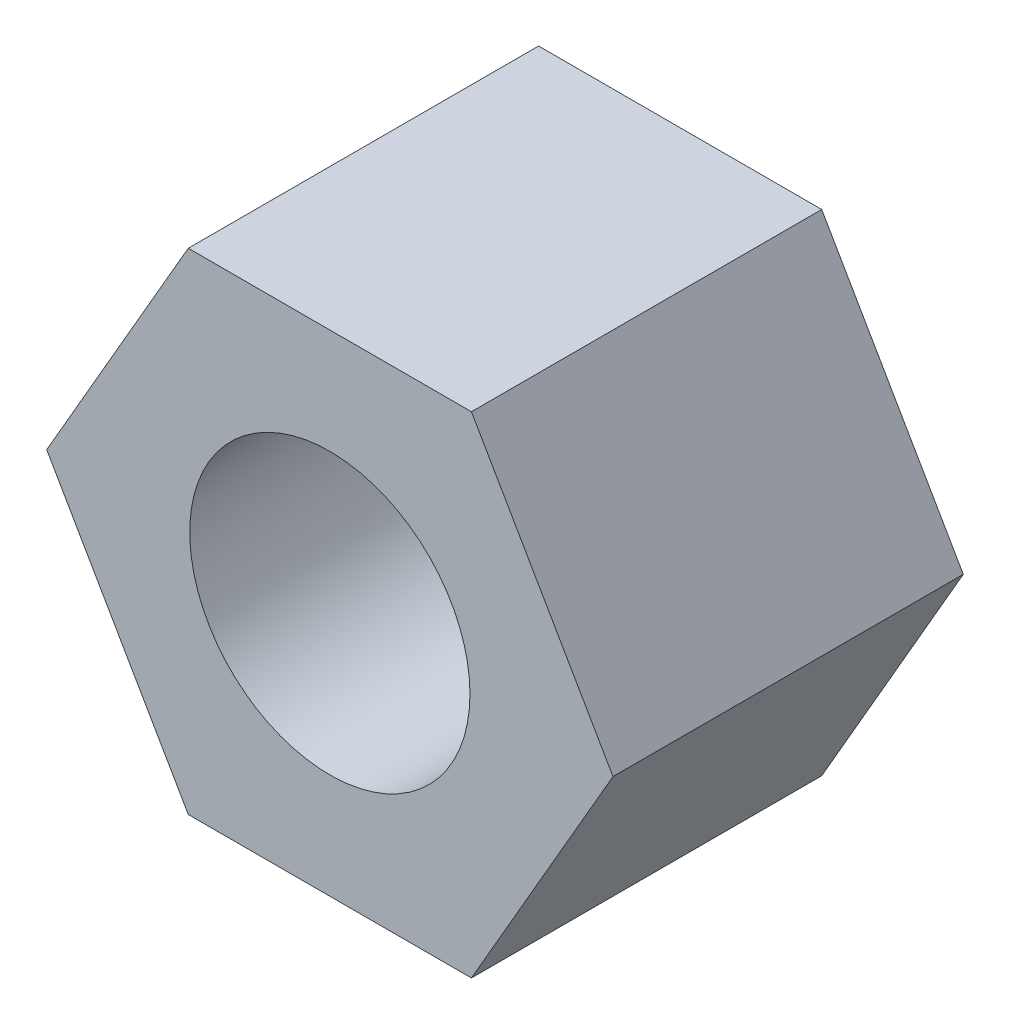
ISO-10303-21;
HEADER;
FILE_DESCRIPTION(('STEP AP214'),'2;1');
FILE_NAME('part.step','',(''),(''),'','','');
FILE_SCHEMA(('AUTOMOTIVE_DESIGN { 1 0 10303 214 1 1 1 1 }'));
ENDSEC;
DATA;
#1=APPLICATION_CONTEXT('core data for automotive mechanical design processes');
#2=APPLICATION_PROTOCOL_DEFINITION('international standard','automotive_design',2000,#1);
#3=PRODUCT_CONTEXT('',#1,'mechanical');
#4=PRODUCT('Part','Part','',(#3));
#5=PRODUCT_RELATED_PRODUCT_CATEGORY('part','',(#4));
#6=PRODUCT_DEFINITION_FORMATION('','',#4);
#7=PRODUCT_DEFINITION_CONTEXT('part definition',#1,'design');
#8=PRODUCT_DEFINITION('design','',#6,#7);
#9=PRODUCT_DEFINITION_SHAPE('','',#8);
#10=(LENGTH_UNIT() NAMED_UNIT(*) SI_UNIT(.MILLI.,.METRE.));
#11=(NAMED_UNIT(*) PLANE_ANGLE_UNIT() SI_UNIT($,.RADIAN.));
#12=(NAMED_UNIT(*) SI_UNIT($,.STERADIAN.) SOLID_ANGLE_UNIT());
#13=UNCERTAINTY_MEASURE_WITH_UNIT(LENGTH_MEASURE(1.E-05),#10,'distance_accuracy_value','');
#14=(GEOMETRIC_REPRESENTATION_CONTEXT(3) GLOBAL_UNCERTAINTY_ASSIGNED_CONTEXT((#13)) GLOBAL_UNIT_ASSIGNED_CONTEXT((#10,
#11,#12)) REPRESENTATION_CONTEXT('',''));
#15=CARTESIAN_POINT('',(0.,0.,0.));
#16=DIRECTION('',(0.,0.,1.));
#17=DIRECTION('',(1.,0.,0.));
#18=AXIS2_PLACEMENT_3D('',#15,#16,#17);
#19=CARTESIAN_POINT('',(0.,0.,5.));
#20=DIRECTION('',(0.,0.,1.));
#21=DIRECTION('',(1.,0.,0.));
#22=AXIS2_PLACEMENT_3D('',#19,#20,#21);
#23=PLANE('',#22);
#24=DIRECTION('',(0.5,0.866025403784439,0.));
#25=VECTOR('',#24,1.);
#26=CARTESIAN_POINT('',(2.02072594216369,-3.5,5.));
#27=LINE('',#26,#25);
#28=CARTESIAN_POINT('',(2.02072594216369,-3.5,5.));
#29=VERTEX_POINT('',#28);
#30=CARTESIAN_POINT('',(4.04145188432738,0.,5.));
#31=VERTEX_POINT('',#30);
#32=EDGE_CURVE('E133',#29,#31,#27,.T.);
#33=ORIENTED_EDGE('',*,*,#32,.T.);
#34=DIRECTION('',(-0.5,0.866025403784439,0.));
#35=VECTOR('',#34,1.);
#36=CARTESIAN_POINT('',(4.04145188432738,0.,5.));
#37=LINE('',#36,#35);
#38=CARTESIAN_POINT('',(2.02072594216369,3.5,5.));
#39=VERTEX_POINT('',#38);
#40=EDGE_CURVE('E94',#31,#39,#37,.T.);
#41=ORIENTED_EDGE('',*,*,#40,.T.);
#42=DIRECTION('',(-1.,0.,0.));
#43=VECTOR('',#42,1.);
#44=CARTESIAN_POINT('',(2.02072594216369,3.5,5.));
#45=LINE('',#44,#43);
#46=CARTESIAN_POINT('',(-2.02072594216369,3.5,5.));
#47=VERTEX_POINT('',#46);
#48=EDGE_CURVE('E106',#39,#47,#45,.T.);
#49=ORIENTED_EDGE('',*,*,#48,.T.);
#50=DIRECTION('',(-0.5,-0.866025403784439,0.));
#51=VECTOR('',#50,1.);
#52=CARTESIAN_POINT('',(-2.02072594216369,3.5,5.));
#53=LINE('',#52,#51);
#54=CARTESIAN_POINT('',(-4.04145188432738,0.,5.));
#55=VERTEX_POINT('',#54);
#56=EDGE_CURVE('E99',#47,#55,#53,.T.);
#57=ORIENTED_EDGE('',*,*,#56,.T.);
#58=DIRECTION('',(0.5,-0.866025403784439,0.));
#59=VECTOR('',#58,1.);
#60=CARTESIAN_POINT('',(-4.04145188432738,0.,5.));
#61=LINE('',#60,#59);
#62=CARTESIAN_POINT('',(-2.02072594216369,-3.5,5.));
#63=VERTEX_POINT('',#62);
#64=EDGE_CURVE('E104',#55,#63,#61,.T.);
#65=ORIENTED_EDGE('',*,*,#64,.T.);
#66=DIRECTION('',(1.,0.,0.));
#67=VECTOR('',#66,1.);
#68=CARTESIAN_POINT('',(-2.02072594216369,-3.5,5.));
#69=LINE('',#68,#67);
#70=EDGE_CURVE('E57',#63,#29,#69,.T.);
#71=ORIENTED_EDGE('',*,*,#70,.T.);
#72=EDGE_LOOP('',(#33,#41,#49,#57,#65,#71));
#73=FACE_BOUND('',#72,.T.);
#74=CARTESIAN_POINT('',(0.,0.,5.));
#75=DIRECTION('',(0.,0.,1.));
#76=DIRECTION('',(1.,0.,0.));
#77=AXIS2_PLACEMENT_3D('',#74,#75,#76);
#78=CIRCLE('',#77,2.);
#79=CARTESIAN_POINT('',(2.,0.,5.));
#80=VERTEX_POINT('',#79);
#81=EDGE_CURVE('E129',#80,#80,#78,.T.);
#82=ORIENTED_EDGE('',*,*,#81,.F.);
#83=EDGE_LOOP('',(#82));
#84=FACE_BOUND('',#83,.T.);
#85=ADVANCED_FACE('F39',(#73,#84),#23,.T.);
#86=CARTESIAN_POINT('',(0.,0.,0.));
#87=DIRECTION('',(0.,0.,1.));
#88=DIRECTION('',(1.,0.,0.));
#89=AXIS2_PLACEMENT_3D('',#86,#87,#88);
#90=PLANE('',#89);
#91=DIRECTION('',(0.5,0.866025403784439,0.));
#92=VECTOR('',#91,1.);
#93=CARTESIAN_POINT('',(2.02072594216369,-3.5,0.));
#94=LINE('',#93,#92);
#95=CARTESIAN_POINT('',(2.02072594216369,-3.5,0.));
#96=VERTEX_POINT('',#95);
#97=CARTESIAN_POINT('',(4.04145188432738,0.,0.));
#98=VERTEX_POINT('',#97);
#99=EDGE_CURVE('E121',#96,#98,#94,.T.);
#100=ORIENTED_EDGE('',*,*,#99,.F.);
#101=DIRECTION('',(1.,0.,0.));
#102=VECTOR('',#101,1.);
#103=CARTESIAN_POINT('',(-2.02072594216369,-3.5,0.));
#104=LINE('',#103,#102);
#105=CARTESIAN_POINT('',(-2.02072594216369,-3.5,0.));
#106=VERTEX_POINT('',#105);
#107=EDGE_CURVE('E85',#106,#96,#104,.T.);
#108=ORIENTED_EDGE('',*,*,#107,.F.);
#109=DIRECTION('',(0.5,-0.866025403784439,0.));
#110=VECTOR('',#109,1.);
#111=CARTESIAN_POINT('',(-4.04145188432738,0.,0.));
#112=LINE('',#111,#110);
#113=CARTESIAN_POINT('',(-4.04145188432738,0.,0.));
#114=VERTEX_POINT('',#113);
#115=EDGE_CURVE('E79',#114,#106,#112,.T.);
#116=ORIENTED_EDGE('',*,*,#115,.F.);
#117=DIRECTION('',(-0.5,-0.866025403784439,0.));
#118=VECTOR('',#117,1.);
#119=CARTESIAN_POINT('',(-2.02072594216369,3.5,0.));
#120=LINE('',#119,#118);
#121=CARTESIAN_POINT('',(-2.02072594216369,3.5,0.));
#122=VERTEX_POINT('',#121);
#123=EDGE_CURVE('E112',#122,#114,#120,.T.);
#124=ORIENTED_EDGE('',*,*,#123,.F.);
#125=DIRECTION('',(-1.,0.,0.));
#126=VECTOR('',#125,1.);
#127=CARTESIAN_POINT('',(2.02072594216369,3.5,0.));
#128=LINE('',#127,#126);
#129=CARTESIAN_POINT('',(2.02072594216369,3.5,0.));
#130=VERTEX_POINT('',#129);
#131=EDGE_CURVE('E130',#130,#122,#128,.T.);
#132=ORIENTED_EDGE('',*,*,#131,.F.);
#133=DIRECTION('',(-0.5,0.866025403784439,0.));
#134=VECTOR('',#133,1.);
#135=CARTESIAN_POINT('',(4.04145188432738,0.,0.));
#136=LINE('',#135,#134);
#137=EDGE_CURVE('E127',#98,#130,#136,.T.);
#138=ORIENTED_EDGE('',*,*,#137,.F.);
#139=EDGE_LOOP('',(#100,#108,#116,#124,#132,#138));
#140=FACE_BOUND('',#139,.T.);
#141=CARTESIAN_POINT('',(0.,0.,0.));
#142=DIRECTION('',(0.,0.,1.));
#143=DIRECTION('',(1.,0.,0.));
#144=AXIS2_PLACEMENT_3D('',#141,#142,#143);
#145=CIRCLE('',#144,2.);
#146=CARTESIAN_POINT('',(2.,0.,0.));
#147=VERTEX_POINT('',#146);
#148=EDGE_CURVE('E226',#147,#147,#145,.T.);
#149=ORIENTED_EDGE('',*,*,#148,.T.);
#150=EDGE_LOOP('',(#149));
#151=FACE_BOUND('',#150,.T.);
#152=ADVANCED_FACE('F144',(#140,#151),#90,.F.);
#153=CARTESIAN_POINT('',(2.02072594216369,-3.5,5.));
#154=DIRECTION('',(-0.866025403784439,0.5,0.));
#155=DIRECTION('',(-0.5,-0.866025403784439,0.));
#156=AXIS2_PLACEMENT_3D('',#153,#154,#155);
#157=PLANE('',#156);
#158=ORIENTED_EDGE('',*,*,#99,.T.);
#159=DIRECTION('',(0.,0.,-1.));
#160=VECTOR('',#159,1.);
#161=CARTESIAN_POINT('',(4.04145188432738,0.,5.));
#162=LINE('',#161,#160);
#163=EDGE_CURVE('E11',#31,#98,#162,.T.);
#164=ORIENTED_EDGE('',*,*,#163,.F.);
#165=ORIENTED_EDGE('',*,*,#32,.F.);
#166=DIRECTION('',(0.,0.,-1.));
#167=VECTOR('',#166,1.);
#168=CARTESIAN_POINT('',(2.02072594216369,-3.5,5.));
#169=LINE('',#168,#167);
#170=EDGE_CURVE('E119',#29,#96,#169,.T.);
#171=ORIENTED_EDGE('',*,*,#170,.T.);
#172=EDGE_LOOP('',(#158,#164,#165,#171));
#173=FACE_BOUND('',#172,.T.);
#174=ADVANCED_FACE('F41',(#173),#157,.F.);
#175=CARTESIAN_POINT('',(4.04145188432738,0.,5.));
#176=DIRECTION('',(-0.866025403784439,-0.5,0.));
#177=DIRECTION('',(0.5,-0.866025403784439,0.));
#178=AXIS2_PLACEMENT_3D('',#175,#176,#177);
#179=PLANE('',#178);
#180=ORIENTED_EDGE('',*,*,#137,.T.);
#181=DIRECTION('',(0.,0.,-1.));
#182=VECTOR('',#181,1.);
#183=CARTESIAN_POINT('',(2.02072594216369,3.5,5.));
#184=LINE('',#183,#182);
#185=EDGE_CURVE('E48',#39,#130,#184,.T.);
#186=ORIENTED_EDGE('',*,*,#185,.F.);
#187=ORIENTED_EDGE('',*,*,#40,.F.);
#188=ORIENTED_EDGE('',*,*,#163,.T.);
#189=EDGE_LOOP('',(#180,#186,#187,#188));
#190=FACE_BOUND('',#189,.T.);
#191=ADVANCED_FACE('F169',(#190),#179,.F.);
#192=CARTESIAN_POINT('',(2.02072594216369,3.5,5.));
#193=DIRECTION('',(0.,-1.,0.));
#194=DIRECTION('',(1.,0.,0.));
#195=AXIS2_PLACEMENT_3D('',#192,#193,#194);
#196=PLANE('',#195);
#197=ORIENTED_EDGE('',*,*,#131,.T.);
#198=DIRECTION('',(0.,0.,-1.));
#199=VECTOR('',#198,1.);
#200=CARTESIAN_POINT('',(-2.02072594216369,3.5,5.));
#201=LINE('',#200,#199);
#202=EDGE_CURVE('E114',#47,#122,#201,.T.);
#203=ORIENTED_EDGE('',*,*,#202,.F.);
#204=ORIENTED_EDGE('',*,*,#48,.F.);
#205=ORIENTED_EDGE('',*,*,#185,.T.);
#206=EDGE_LOOP('',(#197,#203,#204,#205));
#207=FACE_BOUND('',#206,.T.);
#208=ADVANCED_FACE('F142',(#207),#196,.F.);
#209=CARTESIAN_POINT('',(-2.02072594216369,3.5,5.));
#210=DIRECTION('',(0.866025403784439,-0.5,0.));
#211=DIRECTION('',(0.5,0.866025403784439,0.));
#212=AXIS2_PLACEMENT_3D('',#209,#210,#211);
#213=PLANE('',#212);
#214=ORIENTED_EDGE('',*,*,#123,.T.);
#215=DIRECTION('',(0.,0.,-1.));
#216=VECTOR('',#215,1.);
#217=CARTESIAN_POINT('',(-4.04145188432738,0.,5.));
#218=LINE('',#217,#216);
#219=EDGE_CURVE('E111',#55,#114,#218,.T.);
#220=ORIENTED_EDGE('',*,*,#219,.F.);
#221=ORIENTED_EDGE('',*,*,#56,.F.);
#222=ORIENTED_EDGE('',*,*,#202,.T.);
#223=EDGE_LOOP('',(#214,#220,#221,#222));
#224=FACE_BOUND('',#223,.T.);
#225=ADVANCED_FACE('F115',(#224),#213,.F.);
#226=CARTESIAN_POINT('',(-4.04145188432738,0.,5.));
#227=DIRECTION('',(0.866025403784439,0.5,0.));
#228=DIRECTION('',(-0.5,0.866025403784439,0.));
#229=AXIS2_PLACEMENT_3D('',#226,#227,#228);
#230=PLANE('',#229);
#231=ORIENTED_EDGE('',*,*,#115,.T.);
#232=DIRECTION('',(0.,0.,-1.));
#233=VECTOR('',#232,1.);
#234=CARTESIAN_POINT('',(-2.02072594216369,-3.5,5.));
#235=LINE('',#234,#233);
#236=EDGE_CURVE('E116',#63,#106,#235,.T.);
#237=ORIENTED_EDGE('',*,*,#236,.F.);
#238=ORIENTED_EDGE('',*,*,#64,.F.);
#239=ORIENTED_EDGE('',*,*,#219,.T.);
#240=EDGE_LOOP('',(#231,#237,#238,#239));
#241=FACE_BOUND('',#240,.T.);
#242=ADVANCED_FACE('F117',(#241),#230,.F.);
#243=CARTESIAN_POINT('',(-2.02072594216369,-3.5,5.));
#244=DIRECTION('',(0.,1.,0.));
#245=DIRECTION('',(-1.,0.,0.));
#246=AXIS2_PLACEMENT_3D('',#243,#244,#245);
#247=PLANE('',#246);
#248=ORIENTED_EDGE('',*,*,#107,.T.);
#249=ORIENTED_EDGE('',*,*,#170,.F.);
#250=ORIENTED_EDGE('',*,*,#70,.F.);
#251=ORIENTED_EDGE('',*,*,#236,.T.);
#252=EDGE_LOOP('',(#248,#249,#250,#251));
#253=FACE_BOUND('',#252,.T.);
#254=ADVANCED_FACE('F148',(#253),#247,.F.);
#255=CARTESIAN_POINT('',(0.,0.,5.));
#256=DIRECTION('',(0.,0.,-1.));
#257=DIRECTION('',(-1.,0.,0.));
#258=AXIS2_PLACEMENT_3D('',#255,#256,#257);
#259=CYLINDRICAL_SURFACE('',#258,2.);
#260=ORIENTED_EDGE('',*,*,#81,.T.);
#261=EDGE_LOOP('',(#260));
#262=FACE_BOUND('',#261,.T.);
#263=ORIENTED_EDGE('',*,*,#148,.F.);
#264=EDGE_LOOP('',(#263));
#265=FACE_BOUND('',#264,.T.);
#266=ADVANCED_FACE('F152',(#262,#265),#259,.F.);
#267=CLOSED_SHELL('',(#85,#152,#174,#191,#208,#225,#242,#254,#266));
#268=MANIFOLD_SOLID_BREP('B2',#267);
#269=ADVANCED_BREP_SHAPE_REPRESENTATION('',(#18,#268),#14);
#270=SHAPE_DEFINITION_REPRESENTATION(#9,#269);
ENDSEC;
END-ISO-10303-21;
